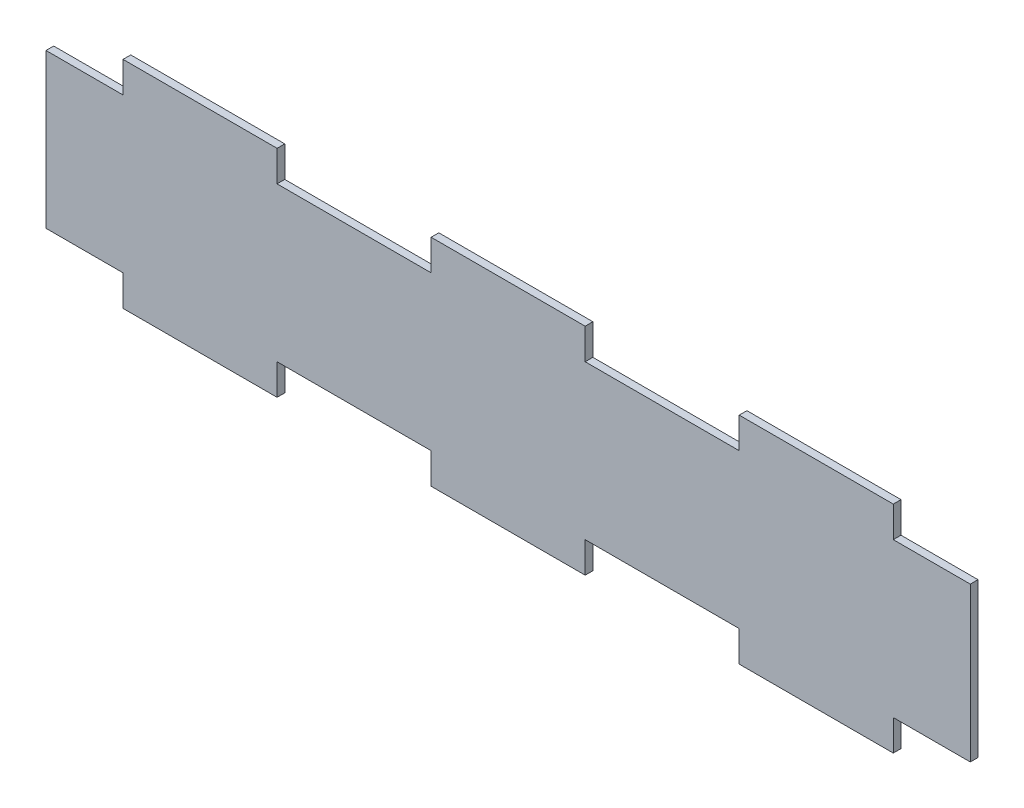
ISO-10303-21;
HEADER;
FILE_DESCRIPTION(('STEP AP214'),'2;1');
FILE_NAME('part.step','',(''),(''),'','','');
FILE_SCHEMA(('AUTOMOTIVE_DESIGN { 1 0 10303 214 1 1 1 1 }'));
ENDSEC;
DATA;
#1=APPLICATION_CONTEXT('core data for automotive mechanical design processes');
#2=APPLICATION_PROTOCOL_DEFINITION('international standard','automotive_design',2000,#1);
#3=PRODUCT_CONTEXT('',#1,'mechanical');
#4=PRODUCT('Part','Part','',(#3));
#5=PRODUCT_RELATED_PRODUCT_CATEGORY('part','',(#4));
#6=PRODUCT_DEFINITION_FORMATION('','',#4);
#7=PRODUCT_DEFINITION_CONTEXT('part definition',#1,'design');
#8=PRODUCT_DEFINITION('design','',#6,#7);
#9=PRODUCT_DEFINITION_SHAPE('','',#8);
#10=(LENGTH_UNIT() NAMED_UNIT(*) SI_UNIT(.MILLI.,.METRE.));
#11=(NAMED_UNIT(*) PLANE_ANGLE_UNIT() SI_UNIT($,.RADIAN.));
#12=(NAMED_UNIT(*) SI_UNIT($,.STERADIAN.) SOLID_ANGLE_UNIT());
#13=UNCERTAINTY_MEASURE_WITH_UNIT(LENGTH_MEASURE(1.E-05),#10,'distance_accuracy_value','');
#14=(GEOMETRIC_REPRESENTATION_CONTEXT(3) GLOBAL_UNCERTAINTY_ASSIGNED_CONTEXT((#13)) GLOBAL_UNIT_ASSIGNED_CONTEXT((#10,
#11,#12)) REPRESENTATION_CONTEXT('',''));
#15=CARTESIAN_POINT('',(0.,0.,0.));
#16=DIRECTION('',(0.,0.,1.));
#17=DIRECTION('',(1.,0.,0.));
#18=AXIS2_PLACEMENT_3D('',#15,#16,#17);
#19=CARTESIAN_POINT('',(900.,120.,5.));
#20=DIRECTION('',(-1.,0.,0.));
#21=DIRECTION('',(0.,0.,1.));
#22=AXIS2_PLACEMENT_3D('',#19,#20,#21);
#23=PLANE('',#22);
#24=DIRECTION('',(0.,1.,0.));
#25=VECTOR('',#24,1.);
#26=CARTESIAN_POINT('',(900.,120.,0.));
#27=LINE('',#26,#25);
#28=CARTESIAN_POINT('',(900.,100.,0.));
#29=VERTEX_POINT('',#28);
#30=CARTESIAN_POINT('',(900.,120.,0.));
#31=VERTEX_POINT('',#30);
#32=EDGE_CURVE('E266',#29,#31,#27,.T.);
#33=ORIENTED_EDGE('',*,*,#32,.T.);
#34=DIRECTION('',(0.,0.,-1.));
#35=VECTOR('',#34,1.);
#36=CARTESIAN_POINT('',(900.,120.,5.));
#37=LINE('',#36,#35);
#38=CARTESIAN_POINT('',(900.,120.,5.));
#39=VERTEX_POINT('',#38);
#40=EDGE_CURVE('E11',#39,#31,#37,.T.);
#41=ORIENTED_EDGE('',*,*,#40,.F.);
#42=DIRECTION('',(0.,1.,0.));
#43=VECTOR('',#42,1.);
#44=CARTESIAN_POINT('',(900.,120.,5.));
#45=LINE('',#44,#43);
#46=CARTESIAN_POINT('',(900.,100.,5.));
#47=VERTEX_POINT('',#46);
#48=EDGE_CURVE('E348',#47,#39,#45,.T.);
#49=ORIENTED_EDGE('',*,*,#48,.F.);
#50=DIRECTION('',(0.,0.,-1.));
#51=VECTOR('',#50,1.);
#52=CARTESIAN_POINT('',(900.,100.,5.));
#53=LINE('',#52,#51);
#54=EDGE_CURVE('E262',#47,#29,#53,.T.);
#55=ORIENTED_EDGE('',*,*,#54,.T.);
#56=EDGE_LOOP('',(#33,#41,#49,#55));
#57=FACE_BOUND('',#56,.T.);
#58=ADVANCED_FACE('F45',(#57),#23,.F.);
#59=CARTESIAN_POINT('',(800.,120.,5.));
#60=DIRECTION('',(0.,-1.,0.));
#61=DIRECTION('',(0.,0.,-1.));
#62=AXIS2_PLACEMENT_3D('',#59,#60,#61);
#63=PLANE('',#62);
#64=DIRECTION('',(-1.,0.,0.));
#65=VECTOR('',#64,1.);
#66=CARTESIAN_POINT('',(800.,120.,0.));
#67=LINE('',#66,#65);
#68=CARTESIAN_POINT('',(800.,120.,0.));
#69=VERTEX_POINT('',#68);
#70=EDGE_CURVE('E270',#31,#69,#67,.T.);
#71=ORIENTED_EDGE('',*,*,#70,.T.);
#72=DIRECTION('',(0.,0.,-1.));
#73=VECTOR('',#72,1.);
#74=CARTESIAN_POINT('',(800.,120.,5.));
#75=LINE('',#74,#73);
#76=CARTESIAN_POINT('',(800.,120.,5.));
#77=VERTEX_POINT('',#76);
#78=EDGE_CURVE('E54',#77,#69,#75,.T.);
#79=ORIENTED_EDGE('',*,*,#78,.F.);
#80=DIRECTION('',(-1.,0.,0.));
#81=VECTOR('',#80,1.);
#82=CARTESIAN_POINT('',(800.,120.,5.));
#83=LINE('',#82,#81);
#84=EDGE_CURVE('E165',#39,#77,#83,.T.);
#85=ORIENTED_EDGE('',*,*,#84,.F.);
#86=ORIENTED_EDGE('',*,*,#40,.T.);
#87=EDGE_LOOP('',(#71,#79,#85,#86));
#88=FACE_BOUND('',#87,.T.);
#89=ADVANCED_FACE('F554',(#88),#63,.F.);
#90=CARTESIAN_POINT('',(800.,100.,5.));
#91=DIRECTION('',(1.,0.,0.));
#92=DIRECTION('',(0.,0.,-1.));
#93=AXIS2_PLACEMENT_3D('',#90,#91,#92);
#94=PLANE('',#93);
#95=DIRECTION('',(0.,-1.,0.));
#96=VECTOR('',#95,1.);
#97=CARTESIAN_POINT('',(800.,100.,0.));
#98=LINE('',#97,#96);
#99=CARTESIAN_POINT('',(800.,100.,0.));
#100=VERTEX_POINT('',#99);
#101=EDGE_CURVE('E273',#69,#100,#98,.T.);
#102=ORIENTED_EDGE('',*,*,#101,.T.);
#103=DIRECTION('',(0.,0.,-1.));
#104=VECTOR('',#103,1.);
#105=CARTESIAN_POINT('',(800.,100.,5.));
#106=LINE('',#105,#104);
#107=CARTESIAN_POINT('',(800.,100.,5.));
#108=VERTEX_POINT('',#107);
#109=EDGE_CURVE('E439',#108,#100,#106,.T.);
#110=ORIENTED_EDGE('',*,*,#109,.F.);
#111=DIRECTION('',(0.,-1.,0.));
#112=VECTOR('',#111,1.);
#113=CARTESIAN_POINT('',(800.,100.,5.));
#114=LINE('',#113,#112);
#115=EDGE_CURVE('E449',#77,#108,#114,.T.);
#116=ORIENTED_EDGE('',*,*,#115,.F.);
#117=ORIENTED_EDGE('',*,*,#78,.T.);
#118=EDGE_LOOP('',(#102,#110,#116,#117));
#119=FACE_BOUND('',#118,.T.);
#120=ADVANCED_FACE('F447',(#119),#94,.F.);
#121=CARTESIAN_POINT('',(700.,100.,5.));
#122=DIRECTION('',(0.,-1.,0.));
#123=DIRECTION('',(0.,0.,-1.));
#124=AXIS2_PLACEMENT_3D('',#121,#122,#123);
#125=PLANE('',#124);
#126=DIRECTION('',(-1.,0.,0.));
#127=VECTOR('',#126,1.);
#128=CARTESIAN_POINT('',(700.,100.,0.));
#129=LINE('',#128,#127);
#130=CARTESIAN_POINT('',(700.,100.,0.));
#131=VERTEX_POINT('',#130);
#132=EDGE_CURVE('E276',#100,#131,#129,.T.);
#133=ORIENTED_EDGE('',*,*,#132,.T.);
#134=DIRECTION('',(0.,0.,-1.));
#135=VECTOR('',#134,1.);
#136=CARTESIAN_POINT('',(700.,100.,5.));
#137=LINE('',#136,#135);
#138=CARTESIAN_POINT('',(700.,100.,5.));
#139=VERTEX_POINT('',#138);
#140=EDGE_CURVE('E435',#139,#131,#137,.T.);
#141=ORIENTED_EDGE('',*,*,#140,.F.);
#142=DIRECTION('',(-1.,0.,0.));
#143=VECTOR('',#142,1.);
#144=CARTESIAN_POINT('',(700.,100.,5.));
#145=LINE('',#144,#143);
#146=EDGE_CURVE('E468',#108,#139,#145,.T.);
#147=ORIENTED_EDGE('',*,*,#146,.F.);
#148=ORIENTED_EDGE('',*,*,#109,.T.);
#149=EDGE_LOOP('',(#133,#141,#147,#148));
#150=FACE_BOUND('',#149,.T.);
#151=ADVANCED_FACE('F458',(#150),#125,.F.);
#152=CARTESIAN_POINT('',(700.,120.,5.));
#153=DIRECTION('',(-1.,0.,0.));
#154=DIRECTION('',(0.,0.,1.));
#155=AXIS2_PLACEMENT_3D('',#152,#153,#154);
#156=PLANE('',#155);
#157=DIRECTION('',(0.,1.,0.));
#158=VECTOR('',#157,1.);
#159=CARTESIAN_POINT('',(700.,120.,0.));
#160=LINE('',#159,#158);
#161=CARTESIAN_POINT('',(700.,120.,0.));
#162=VERTEX_POINT('',#161);
#163=EDGE_CURVE('E279',#131,#162,#160,.T.);
#164=ORIENTED_EDGE('',*,*,#163,.T.);
#165=DIRECTION('',(0.,0.,-1.));
#166=VECTOR('',#165,1.);
#167=CARTESIAN_POINT('',(700.,120.,5.));
#168=LINE('',#167,#166);
#169=CARTESIAN_POINT('',(700.,120.,5.));
#170=VERTEX_POINT('',#169);
#171=EDGE_CURVE('E431',#170,#162,#168,.T.);
#172=ORIENTED_EDGE('',*,*,#171,.F.);
#173=DIRECTION('',(0.,1.,0.));
#174=VECTOR('',#173,1.);
#175=CARTESIAN_POINT('',(700.,120.,5.));
#176=LINE('',#175,#174);
#177=EDGE_CURVE('E464',#139,#170,#176,.T.);
#178=ORIENTED_EDGE('',*,*,#177,.F.);
#179=ORIENTED_EDGE('',*,*,#140,.T.);
#180=EDGE_LOOP('',(#164,#172,#178,#179));
#181=FACE_BOUND('',#180,.T.);
#182=ADVANCED_FACE('F462',(#181),#156,.F.);
#183=CARTESIAN_POINT('',(600.,120.,5.));
#184=DIRECTION('',(0.,-1.,0.));
#185=DIRECTION('',(0.,0.,-1.));
#186=AXIS2_PLACEMENT_3D('',#183,#184,#185);
#187=PLANE('',#186);
#188=DIRECTION('',(-1.,0.,0.));
#189=VECTOR('',#188,1.);
#190=CARTESIAN_POINT('',(600.,120.,0.));
#191=LINE('',#190,#189);
#192=CARTESIAN_POINT('',(600.,120.,0.));
#193=VERTEX_POINT('',#192);
#194=EDGE_CURVE('E282',#162,#193,#191,.T.);
#195=ORIENTED_EDGE('',*,*,#194,.T.);
#196=DIRECTION('',(0.,0.,-1.));
#197=VECTOR('',#196,1.);
#198=CARTESIAN_POINT('',(600.,120.,5.));
#199=LINE('',#198,#197);
#200=CARTESIAN_POINT('',(600.,120.,5.));
#201=VERTEX_POINT('',#200);
#202=EDGE_CURVE('E427',#201,#193,#199,.T.);
#203=ORIENTED_EDGE('',*,*,#202,.F.);
#204=DIRECTION('',(-1.,0.,0.));
#205=VECTOR('',#204,1.);
#206=CARTESIAN_POINT('',(600.,120.,5.));
#207=LINE('',#206,#205);
#208=EDGE_CURVE('E467',#170,#201,#207,.T.);
#209=ORIENTED_EDGE('',*,*,#208,.F.);
#210=ORIENTED_EDGE('',*,*,#171,.T.);
#211=EDGE_LOOP('',(#195,#203,#209,#210));
#212=FACE_BOUND('',#211,.T.);
#213=ADVANCED_FACE('F567',(#212),#187,.F.);
#214=CARTESIAN_POINT('',(600.,100.,5.));
#215=DIRECTION('',(1.,0.,0.));
#216=DIRECTION('',(0.,0.,-1.));
#217=AXIS2_PLACEMENT_3D('',#214,#215,#216);
#218=PLANE('',#217);
#219=DIRECTION('',(0.,-1.,0.));
#220=VECTOR('',#219,1.);
#221=CARTESIAN_POINT('',(600.,100.,0.));
#222=LINE('',#221,#220);
#223=CARTESIAN_POINT('',(600.,100.,0.));
#224=VERTEX_POINT('',#223);
#225=EDGE_CURVE('E285',#193,#224,#222,.T.);
#226=ORIENTED_EDGE('',*,*,#225,.T.);
#227=DIRECTION('',(0.,0.,-1.));
#228=VECTOR('',#227,1.);
#229=CARTESIAN_POINT('',(600.,100.,5.));
#230=LINE('',#229,#228);
#231=CARTESIAN_POINT('',(600.,100.,5.));
#232=VERTEX_POINT('',#231);
#233=EDGE_CURVE('E423',#232,#224,#230,.T.);
#234=ORIENTED_EDGE('',*,*,#233,.F.);
#235=DIRECTION('',(0.,-1.,0.));
#236=VECTOR('',#235,1.);
#237=CARTESIAN_POINT('',(600.,100.,5.));
#238=LINE('',#237,#236);
#239=EDGE_CURVE('E472',#201,#232,#238,.T.);
#240=ORIENTED_EDGE('',*,*,#239,.F.);
#241=ORIENTED_EDGE('',*,*,#202,.T.);
#242=EDGE_LOOP('',(#226,#234,#240,#241));
#243=FACE_BOUND('',#242,.T.);
#244=ADVANCED_FACE('F570',(#243),#218,.F.);
#245=CARTESIAN_POINT('',(550.,100.,5.));
#246=DIRECTION('',(0.,-1.,0.));
#247=DIRECTION('',(0.,0.,-1.));
#248=AXIS2_PLACEMENT_3D('',#245,#246,#247);
#249=PLANE('',#248);
#250=DIRECTION('',(-1.,0.,0.));
#251=VECTOR('',#250,1.);
#252=CARTESIAN_POINT('',(550.,100.,0.));
#253=LINE('',#252,#251);
#254=CARTESIAN_POINT('',(550.,100.,0.));
#255=VERTEX_POINT('',#254);
#256=EDGE_CURVE('E288',#224,#255,#253,.T.);
#257=ORIENTED_EDGE('',*,*,#256,.T.);
#258=DIRECTION('',(0.,0.,-1.));
#259=VECTOR('',#258,1.);
#260=CARTESIAN_POINT('',(550.,100.,5.));
#261=LINE('',#260,#259);
#262=CARTESIAN_POINT('',(550.,100.,5.));
#263=VERTEX_POINT('',#262);
#264=EDGE_CURVE('E419',#263,#255,#261,.T.);
#265=ORIENTED_EDGE('',*,*,#264,.F.);
#266=DIRECTION('',(-1.,0.,0.));
#267=VECTOR('',#266,1.);
#268=CARTESIAN_POINT('',(550.,100.,5.));
#269=LINE('',#268,#267);
#270=EDGE_CURVE('E479',#232,#263,#269,.T.);
#271=ORIENTED_EDGE('',*,*,#270,.F.);
#272=ORIENTED_EDGE('',*,*,#233,.T.);
#273=EDGE_LOOP('',(#257,#265,#271,#272));
#274=FACE_BOUND('',#273,.T.);
#275=ADVANCED_FACE('F574',(#274),#249,.F.);
#276=CARTESIAN_POINT('',(550.,100.,5.));
#277=DIRECTION('',(1.,0.,0.));
#278=DIRECTION('',(0.,0.,-1.));
#279=AXIS2_PLACEMENT_3D('',#276,#277,#278);
#280=PLANE('',#279);
#281=DIRECTION('',(0.,-1.,0.));
#282=VECTOR('',#281,1.);
#283=CARTESIAN_POINT('',(550.,100.,0.));
#284=LINE('',#283,#282);
#285=CARTESIAN_POINT('',(550.,0.,0.));
#286=VERTEX_POINT('',#285);
#287=EDGE_CURVE('E291',#255,#286,#284,.T.);
#288=ORIENTED_EDGE('',*,*,#287,.T.);
#289=DIRECTION('',(0.,0.,-1.));
#290=VECTOR('',#289,1.);
#291=CARTESIAN_POINT('',(550.,0.,5.));
#292=LINE('',#291,#290);
#293=CARTESIAN_POINT('',(550.,0.,5.));
#294=VERTEX_POINT('',#293);
#295=EDGE_CURVE('E415',#294,#286,#292,.T.);
#296=ORIENTED_EDGE('',*,*,#295,.F.);
#297=DIRECTION('',(0.,-1.,0.));
#298=VECTOR('',#297,1.);
#299=CARTESIAN_POINT('',(550.,100.,5.));
#300=LINE('',#299,#298);
#301=EDGE_CURVE('E482',#263,#294,#300,.T.);
#302=ORIENTED_EDGE('',*,*,#301,.F.);
#303=ORIENTED_EDGE('',*,*,#264,.T.);
#304=EDGE_LOOP('',(#288,#296,#302,#303));
#305=FACE_BOUND('',#304,.T.);
#306=ADVANCED_FACE('F578',(#305),#280,.F.);
#307=CARTESIAN_POINT('',(600.,0.,5.));
#308=DIRECTION('',(0.,1.,0.));
#309=DIRECTION('',(0.,0.,1.));
#310=AXIS2_PLACEMENT_3D('',#307,#308,#309);
#311=PLANE('',#310);
#312=DIRECTION('',(1.,0.,0.));
#313=VECTOR('',#312,1.);
#314=CARTESIAN_POINT('',(600.,0.,0.));
#315=LINE('',#314,#313);
#316=CARTESIAN_POINT('',(600.,0.,0.));
#317=VERTEX_POINT('',#316);
#318=EDGE_CURVE('E294',#286,#317,#315,.T.);
#319=ORIENTED_EDGE('',*,*,#318,.T.);
#320=DIRECTION('',(0.,0.,-1.));
#321=VECTOR('',#320,1.);
#322=CARTESIAN_POINT('',(600.,0.,5.));
#323=LINE('',#322,#321);
#324=CARTESIAN_POINT('',(600.,0.,5.));
#325=VERTEX_POINT('',#324);
#326=EDGE_CURVE('E411',#325,#317,#323,.T.);
#327=ORIENTED_EDGE('',*,*,#326,.F.);
#328=DIRECTION('',(1.,0.,0.));
#329=VECTOR('',#328,1.);
#330=CARTESIAN_POINT('',(600.,0.,5.));
#331=LINE('',#330,#329);
#332=EDGE_CURVE('E485',#294,#325,#331,.T.);
#333=ORIENTED_EDGE('',*,*,#332,.F.);
#334=ORIENTED_EDGE('',*,*,#295,.T.);
#335=EDGE_LOOP('',(#319,#327,#333,#334));
#336=FACE_BOUND('',#335,.T.);
#337=ADVANCED_FACE('F582',(#336),#311,.F.);
#338=CARTESIAN_POINT('',(600.,-20.,5.));
#339=DIRECTION('',(1.,0.,0.));
#340=DIRECTION('',(0.,0.,-1.));
#341=AXIS2_PLACEMENT_3D('',#338,#339,#340);
#342=PLANE('',#341);
#343=DIRECTION('',(0.,-1.,0.));
#344=VECTOR('',#343,1.);
#345=CARTESIAN_POINT('',(600.,-20.,0.));
#346=LINE('',#345,#344);
#347=CARTESIAN_POINT('',(600.,-20.,0.));
#348=VERTEX_POINT('',#347);
#349=EDGE_CURVE('E297',#317,#348,#346,.T.);
#350=ORIENTED_EDGE('',*,*,#349,.T.);
#351=DIRECTION('',(0.,0.,-1.));
#352=VECTOR('',#351,1.);
#353=CARTESIAN_POINT('',(600.,-20.,5.));
#354=LINE('',#353,#352);
#355=CARTESIAN_POINT('',(600.,-20.,5.));
#356=VERTEX_POINT('',#355);
#357=EDGE_CURVE('E407',#356,#348,#354,.T.);
#358=ORIENTED_EDGE('',*,*,#357,.F.);
#359=DIRECTION('',(0.,-1.,0.));
#360=VECTOR('',#359,1.);
#361=CARTESIAN_POINT('',(600.,-20.,5.));
#362=LINE('',#361,#360);
#363=EDGE_CURVE('E488',#325,#356,#362,.T.);
#364=ORIENTED_EDGE('',*,*,#363,.F.);
#365=ORIENTED_EDGE('',*,*,#326,.T.);
#366=EDGE_LOOP('',(#350,#358,#364,#365));
#367=FACE_BOUND('',#366,.T.);
#368=ADVANCED_FACE('F586',(#367),#342,.F.);
#369=CARTESIAN_POINT('',(700.,-20.,5.));
#370=DIRECTION('',(0.,1.,0.));
#371=DIRECTION('',(0.,0.,1.));
#372=AXIS2_PLACEMENT_3D('',#369,#370,#371);
#373=PLANE('',#372);
#374=DIRECTION('',(1.,0.,0.));
#375=VECTOR('',#374,1.);
#376=CARTESIAN_POINT('',(700.,-20.,0.));
#377=LINE('',#376,#375);
#378=CARTESIAN_POINT('',(700.,-20.,0.));
#379=VERTEX_POINT('',#378);
#380=EDGE_CURVE('E300',#348,#379,#377,.T.);
#381=ORIENTED_EDGE('',*,*,#380,.T.);
#382=DIRECTION('',(0.,0.,-1.));
#383=VECTOR('',#382,1.);
#384=CARTESIAN_POINT('',(700.,-20.,5.));
#385=LINE('',#384,#383);
#386=CARTESIAN_POINT('',(700.,-20.,5.));
#387=VERTEX_POINT('',#386);
#388=EDGE_CURVE('E403',#387,#379,#385,.T.);
#389=ORIENTED_EDGE('',*,*,#388,.F.);
#390=DIRECTION('',(1.,0.,0.));
#391=VECTOR('',#390,1.);
#392=CARTESIAN_POINT('',(700.,-20.,5.));
#393=LINE('',#392,#391);
#394=EDGE_CURVE('E491',#356,#387,#393,.T.);
#395=ORIENTED_EDGE('',*,*,#394,.F.);
#396=ORIENTED_EDGE('',*,*,#357,.T.);
#397=EDGE_LOOP('',(#381,#389,#395,#396));
#398=FACE_BOUND('',#397,.T.);
#399=ADVANCED_FACE('F590',(#398),#373,.F.);
#400=CARTESIAN_POINT('',(700.,0.,5.));
#401=DIRECTION('',(-1.,0.,0.));
#402=DIRECTION('',(0.,0.,1.));
#403=AXIS2_PLACEMENT_3D('',#400,#401,#402);
#404=PLANE('',#403);
#405=DIRECTION('',(0.,1.,0.));
#406=VECTOR('',#405,1.);
#407=CARTESIAN_POINT('',(700.,0.,0.));
#408=LINE('',#407,#406);
#409=CARTESIAN_POINT('',(700.,0.,0.));
#410=VERTEX_POINT('',#409);
#411=EDGE_CURVE('E303',#379,#410,#408,.T.);
#412=ORIENTED_EDGE('',*,*,#411,.T.);
#413=DIRECTION('',(0.,0.,-1.));
#414=VECTOR('',#413,1.);
#415=CARTESIAN_POINT('',(700.,0.,5.));
#416=LINE('',#415,#414);
#417=CARTESIAN_POINT('',(700.,0.,5.));
#418=VERTEX_POINT('',#417);
#419=EDGE_CURVE('E399',#418,#410,#416,.T.);
#420=ORIENTED_EDGE('',*,*,#419,.F.);
#421=DIRECTION('',(0.,1.,0.));
#422=VECTOR('',#421,1.);
#423=CARTESIAN_POINT('',(700.,0.,5.));
#424=LINE('',#423,#422);
#425=EDGE_CURVE('E494',#387,#418,#424,.T.);
#426=ORIENTED_EDGE('',*,*,#425,.F.);
#427=ORIENTED_EDGE('',*,*,#388,.T.);
#428=EDGE_LOOP('',(#412,#420,#426,#427));
#429=FACE_BOUND('',#428,.T.);
#430=ADVANCED_FACE('F594',(#429),#404,.F.);
#431=CARTESIAN_POINT('',(800.,0.,5.));
#432=DIRECTION('',(0.,1.,0.));
#433=DIRECTION('',(0.,0.,1.));
#434=AXIS2_PLACEMENT_3D('',#431,#432,#433);
#435=PLANE('',#434);
#436=DIRECTION('',(1.,0.,0.));
#437=VECTOR('',#436,1.);
#438=CARTESIAN_POINT('',(800.,0.,0.));
#439=LINE('',#438,#437);
#440=CARTESIAN_POINT('',(800.,0.,0.));
#441=VERTEX_POINT('',#440);
#442=EDGE_CURVE('E306',#410,#441,#439,.T.);
#443=ORIENTED_EDGE('',*,*,#442,.T.);
#444=DIRECTION('',(0.,0.,-1.));
#445=VECTOR('',#444,1.);
#446=CARTESIAN_POINT('',(800.,0.,5.));
#447=LINE('',#446,#445);
#448=CARTESIAN_POINT('',(800.,0.,5.));
#449=VERTEX_POINT('',#448);
#450=EDGE_CURVE('E395',#449,#441,#447,.T.);
#451=ORIENTED_EDGE('',*,*,#450,.F.);
#452=DIRECTION('',(1.,0.,0.));
#453=VECTOR('',#452,1.);
#454=CARTESIAN_POINT('',(800.,0.,5.));
#455=LINE('',#454,#453);
#456=EDGE_CURVE('E497',#418,#449,#455,.T.);
#457=ORIENTED_EDGE('',*,*,#456,.F.);
#458=ORIENTED_EDGE('',*,*,#419,.T.);
#459=EDGE_LOOP('',(#443,#451,#457,#458));
#460=FACE_BOUND('',#459,.T.);
#461=ADVANCED_FACE('F598',(#460),#435,.F.);
#462=CARTESIAN_POINT('',(800.,-20.,5.));
#463=DIRECTION('',(1.,0.,0.));
#464=DIRECTION('',(0.,0.,-1.));
#465=AXIS2_PLACEMENT_3D('',#462,#463,#464);
#466=PLANE('',#465);
#467=DIRECTION('',(0.,-1.,0.));
#468=VECTOR('',#467,1.);
#469=CARTESIAN_POINT('',(800.,-20.,0.));
#470=LINE('',#469,#468);
#471=CARTESIAN_POINT('',(800.,-20.,0.));
#472=VERTEX_POINT('',#471);
#473=EDGE_CURVE('E309',#441,#472,#470,.T.);
#474=ORIENTED_EDGE('',*,*,#473,.T.);
#475=DIRECTION('',(0.,0.,-1.));
#476=VECTOR('',#475,1.);
#477=CARTESIAN_POINT('',(800.,-20.,5.));
#478=LINE('',#477,#476);
#479=CARTESIAN_POINT('',(800.,-20.,5.));
#480=VERTEX_POINT('',#479);
#481=EDGE_CURVE('E391',#480,#472,#478,.T.);
#482=ORIENTED_EDGE('',*,*,#481,.F.);
#483=DIRECTION('',(0.,-1.,0.));
#484=VECTOR('',#483,1.);
#485=CARTESIAN_POINT('',(800.,-20.,5.));
#486=LINE('',#485,#484);
#487=EDGE_CURVE('E500',#449,#480,#486,.T.);
#488=ORIENTED_EDGE('',*,*,#487,.F.);
#489=ORIENTED_EDGE('',*,*,#450,.T.);
#490=EDGE_LOOP('',(#474,#482,#488,#489));
#491=FACE_BOUND('',#490,.T.);
#492=ADVANCED_FACE('F602',(#491),#466,.F.);
#493=CARTESIAN_POINT('',(900.,-20.,5.));
#494=DIRECTION('',(0.,1.,0.));
#495=DIRECTION('',(0.,0.,1.));
#496=AXIS2_PLACEMENT_3D('',#493,#494,#495);
#497=PLANE('',#496);
#498=DIRECTION('',(1.,0.,0.));
#499=VECTOR('',#498,1.);
#500=CARTESIAN_POINT('',(900.,-20.,0.));
#501=LINE('',#500,#499);
#502=CARTESIAN_POINT('',(900.,-20.,0.));
#503=VERTEX_POINT('',#502);
#504=EDGE_CURVE('E312',#472,#503,#501,.T.);
#505=ORIENTED_EDGE('',*,*,#504,.T.);
#506=DIRECTION('',(0.,0.,-1.));
#507=VECTOR('',#506,1.);
#508=CARTESIAN_POINT('',(900.,-20.,5.));
#509=LINE('',#508,#507);
#510=CARTESIAN_POINT('',(900.,-20.,5.));
#511=VERTEX_POINT('',#510);
#512=EDGE_CURVE('E387',#511,#503,#509,.T.);
#513=ORIENTED_EDGE('',*,*,#512,.F.);
#514=DIRECTION('',(1.,0.,0.));
#515=VECTOR('',#514,1.);
#516=CARTESIAN_POINT('',(900.,-20.,5.));
#517=LINE('',#516,#515);
#518=EDGE_CURVE('E503',#480,#511,#517,.T.);
#519=ORIENTED_EDGE('',*,*,#518,.F.);
#520=ORIENTED_EDGE('',*,*,#481,.T.);
#521=EDGE_LOOP('',(#505,#513,#519,#520));
#522=FACE_BOUND('',#521,.T.);
#523=ADVANCED_FACE('F606',(#522),#497,.F.);
#524=CARTESIAN_POINT('',(900.,0.,5.));
#525=DIRECTION('',(-1.,0.,0.));
#526=DIRECTION('',(0.,0.,1.));
#527=AXIS2_PLACEMENT_3D('',#524,#525,#526);
#528=PLANE('',#527);
#529=DIRECTION('',(0.,1.,0.));
#530=VECTOR('',#529,1.);
#531=CARTESIAN_POINT('',(900.,0.,0.));
#532=LINE('',#531,#530);
#533=CARTESIAN_POINT('',(900.,0.,0.));
#534=VERTEX_POINT('',#533);
#535=EDGE_CURVE('E315',#503,#534,#532,.T.);
#536=ORIENTED_EDGE('',*,*,#535,.T.);
#537=DIRECTION('',(0.,0.,-1.));
#538=VECTOR('',#537,1.);
#539=CARTESIAN_POINT('',(900.,0.,5.));
#540=LINE('',#539,#538);
#541=CARTESIAN_POINT('',(900.,0.,5.));
#542=VERTEX_POINT('',#541);
#543=EDGE_CURVE('E383',#542,#534,#540,.T.);
#544=ORIENTED_EDGE('',*,*,#543,.F.);
#545=DIRECTION('',(0.,1.,0.));
#546=VECTOR('',#545,1.);
#547=CARTESIAN_POINT('',(900.,0.,5.));
#548=LINE('',#547,#546);
#549=EDGE_CURVE('E506',#511,#542,#548,.T.);
#550=ORIENTED_EDGE('',*,*,#549,.F.);
#551=ORIENTED_EDGE('',*,*,#512,.T.);
#552=EDGE_LOOP('',(#536,#544,#550,#551));
#553=FACE_BOUND('',#552,.T.);
#554=ADVANCED_FACE('F610',(#553),#528,.F.);
#555=CARTESIAN_POINT('',(1000.,0.,5.));
#556=DIRECTION('',(0.,1.,0.));
#557=DIRECTION('',(0.,0.,1.));
#558=AXIS2_PLACEMENT_3D('',#555,#556,#557);
#559=PLANE('',#558);
#560=DIRECTION('',(1.,0.,0.));
#561=VECTOR('',#560,1.);
#562=CARTESIAN_POINT('',(1000.,0.,0.));
#563=LINE('',#562,#561);
#564=CARTESIAN_POINT('',(1000.,0.,0.));
#565=VERTEX_POINT('',#564);
#566=EDGE_CURVE('E318',#534,#565,#563,.T.);
#567=ORIENTED_EDGE('',*,*,#566,.T.);
#568=DIRECTION('',(0.,0.,-1.));
#569=VECTOR('',#568,1.);
#570=CARTESIAN_POINT('',(1000.,0.,5.));
#571=LINE('',#570,#569);
#572=CARTESIAN_POINT('',(1000.,0.,5.));
#573=VERTEX_POINT('',#572);
#574=EDGE_CURVE('E379',#573,#565,#571,.T.);
#575=ORIENTED_EDGE('',*,*,#574,.F.);
#576=DIRECTION('',(1.,0.,0.));
#577=VECTOR('',#576,1.);
#578=CARTESIAN_POINT('',(1000.,0.,5.));
#579=LINE('',#578,#577);
#580=EDGE_CURVE('E509',#542,#573,#579,.T.);
#581=ORIENTED_EDGE('',*,*,#580,.F.);
#582=ORIENTED_EDGE('',*,*,#543,.T.);
#583=EDGE_LOOP('',(#567,#575,#581,#582));
#584=FACE_BOUND('',#583,.T.);
#585=ADVANCED_FACE('F614',(#584),#559,.F.);
#586=CARTESIAN_POINT('',(1000.,-20.,5.));
#587=DIRECTION('',(1.,0.,0.));
#588=DIRECTION('',(0.,0.,-1.));
#589=AXIS2_PLACEMENT_3D('',#586,#587,#588);
#590=PLANE('',#589);
#591=DIRECTION('',(0.,-1.,0.));
#592=VECTOR('',#591,1.);
#593=CARTESIAN_POINT('',(1000.,-20.,0.));
#594=LINE('',#593,#592);
#595=CARTESIAN_POINT('',(1000.,-20.,0.));
#596=VERTEX_POINT('',#595);
#597=EDGE_CURVE('E321',#565,#596,#594,.T.);
#598=ORIENTED_EDGE('',*,*,#597,.T.);
#599=DIRECTION('',(0.,0.,-1.));
#600=VECTOR('',#599,1.);
#601=CARTESIAN_POINT('',(1000.,-20.,5.));
#602=LINE('',#601,#600);
#603=CARTESIAN_POINT('',(1000.,-20.,5.));
#604=VERTEX_POINT('',#603);
#605=EDGE_CURVE('E375',#604,#596,#602,.T.);
#606=ORIENTED_EDGE('',*,*,#605,.F.);
#607=DIRECTION('',(0.,-1.,0.));
#608=VECTOR('',#607,1.);
#609=CARTESIAN_POINT('',(1000.,-20.,5.));
#610=LINE('',#609,#608);
#611=EDGE_CURVE('E512',#573,#604,#610,.T.);
#612=ORIENTED_EDGE('',*,*,#611,.F.);
#613=ORIENTED_EDGE('',*,*,#574,.T.);
#614=EDGE_LOOP('',(#598,#606,#612,#613));
#615=FACE_BOUND('',#614,.T.);
#616=ADVANCED_FACE('F618',(#615),#590,.F.);
#617=CARTESIAN_POINT('',(1100.,-20.,5.));
#618=DIRECTION('',(0.,1.,0.));
#619=DIRECTION('',(0.,0.,1.));
#620=AXIS2_PLACEMENT_3D('',#617,#618,#619);
#621=PLANE('',#620);
#622=DIRECTION('',(1.,0.,0.));
#623=VECTOR('',#622,1.);
#624=CARTESIAN_POINT('',(1100.,-20.,0.));
#625=LINE('',#624,#623);
#626=CARTESIAN_POINT('',(1100.,-20.,0.));
#627=VERTEX_POINT('',#626);
#628=EDGE_CURVE('E324',#596,#627,#625,.T.);
#629=ORIENTED_EDGE('',*,*,#628,.T.);
#630=DIRECTION('',(0.,0.,-1.));
#631=VECTOR('',#630,1.);
#632=CARTESIAN_POINT('',(1100.,-20.,5.));
#633=LINE('',#632,#631);
#634=CARTESIAN_POINT('',(1100.,-20.,5.));
#635=VERTEX_POINT('',#634);
#636=EDGE_CURVE('E371',#635,#627,#633,.T.);
#637=ORIENTED_EDGE('',*,*,#636,.F.);
#638=DIRECTION('',(1.,0.,0.));
#639=VECTOR('',#638,1.);
#640=CARTESIAN_POINT('',(1100.,-20.,5.));
#641=LINE('',#640,#639);
#642=EDGE_CURVE('E515',#604,#635,#641,.T.);
#643=ORIENTED_EDGE('',*,*,#642,.F.);
#644=ORIENTED_EDGE('',*,*,#605,.T.);
#645=EDGE_LOOP('',(#629,#637,#643,#644));
#646=FACE_BOUND('',#645,.T.);
#647=ADVANCED_FACE('F622',(#646),#621,.F.);
#648=CARTESIAN_POINT('',(1100.,0.,5.));
#649=DIRECTION('',(-1.,0.,0.));
#650=DIRECTION('',(0.,0.,1.));
#651=AXIS2_PLACEMENT_3D('',#648,#649,#650);
#652=PLANE('',#651);
#653=DIRECTION('',(0.,1.,0.));
#654=VECTOR('',#653,1.);
#655=CARTESIAN_POINT('',(1100.,0.,0.));
#656=LINE('',#655,#654);
#657=CARTESIAN_POINT('',(1100.,0.,0.));
#658=VERTEX_POINT('',#657);
#659=EDGE_CURVE('E327',#627,#658,#656,.T.);
#660=ORIENTED_EDGE('',*,*,#659,.T.);
#661=DIRECTION('',(0.,0.,-1.));
#662=VECTOR('',#661,1.);
#663=CARTESIAN_POINT('',(1100.,0.,5.));
#664=LINE('',#663,#662);
#665=CARTESIAN_POINT('',(1100.,0.,5.));
#666=VERTEX_POINT('',#665);
#667=EDGE_CURVE('E367',#666,#658,#664,.T.);
#668=ORIENTED_EDGE('',*,*,#667,.F.);
#669=DIRECTION('',(0.,1.,0.));
#670=VECTOR('',#669,1.);
#671=CARTESIAN_POINT('',(1100.,0.,5.));
#672=LINE('',#671,#670);
#673=EDGE_CURVE('E518',#635,#666,#672,.T.);
#674=ORIENTED_EDGE('',*,*,#673,.F.);
#675=ORIENTED_EDGE('',*,*,#636,.T.);
#676=EDGE_LOOP('',(#660,#668,#674,#675));
#677=FACE_BOUND('',#676,.T.);
#678=ADVANCED_FACE('F626',(#677),#652,.F.);
#679=CARTESIAN_POINT('',(1150.,0.,5.));
#680=DIRECTION('',(0.,1.,0.));
#681=DIRECTION('',(0.,0.,1.));
#682=AXIS2_PLACEMENT_3D('',#679,#680,#681);
#683=PLANE('',#682);
#684=DIRECTION('',(1.,0.,0.));
#685=VECTOR('',#684,1.);
#686=CARTESIAN_POINT('',(1150.,0.,0.));
#687=LINE('',#686,#685);
#688=CARTESIAN_POINT('',(1150.,0.,0.));
#689=VERTEX_POINT('',#688);
#690=EDGE_CURVE('E330',#658,#689,#687,.T.);
#691=ORIENTED_EDGE('',*,*,#690,.T.);
#692=DIRECTION('',(0.,0.,-1.));
#693=VECTOR('',#692,1.);
#694=CARTESIAN_POINT('',(1150.,0.,5.));
#695=LINE('',#694,#693);
#696=CARTESIAN_POINT('',(1150.,0.,5.));
#697=VERTEX_POINT('',#696);
#698=EDGE_CURVE('E363',#697,#689,#695,.T.);
#699=ORIENTED_EDGE('',*,*,#698,.F.);
#700=DIRECTION('',(1.,0.,0.));
#701=VECTOR('',#700,1.);
#702=CARTESIAN_POINT('',(1150.,0.,5.));
#703=LINE('',#702,#701);
#704=EDGE_CURVE('E521',#666,#697,#703,.T.);
#705=ORIENTED_EDGE('',*,*,#704,.F.);
#706=ORIENTED_EDGE('',*,*,#667,.T.);
#707=EDGE_LOOP('',(#691,#699,#705,#706));
#708=FACE_BOUND('',#707,.T.);
#709=ADVANCED_FACE('F630',(#708),#683,.F.);
#710=CARTESIAN_POINT('',(1150.,100.,5.));
#711=DIRECTION('',(-1.,0.,0.));
#712=DIRECTION('',(0.,0.,1.));
#713=AXIS2_PLACEMENT_3D('',#710,#711,#712);
#714=PLANE('',#713);
#715=DIRECTION('',(0.,1.,0.));
#716=VECTOR('',#715,1.);
#717=CARTESIAN_POINT('',(1150.,100.,0.));
#718=LINE('',#717,#716);
#719=CARTESIAN_POINT('',(1150.,100.,0.));
#720=VERTEX_POINT('',#719);
#721=EDGE_CURVE('E333',#689,#720,#718,.T.);
#722=ORIENTED_EDGE('',*,*,#721,.T.);
#723=DIRECTION('',(0.,0.,-1.));
#724=VECTOR('',#723,1.);
#725=CARTESIAN_POINT('',(1150.,100.,5.));
#726=LINE('',#725,#724);
#727=CARTESIAN_POINT('',(1150.,100.,5.));
#728=VERTEX_POINT('',#727);
#729=EDGE_CURVE('E359',#728,#720,#726,.T.);
#730=ORIENTED_EDGE('',*,*,#729,.F.);
#731=DIRECTION('',(0.,1.,0.));
#732=VECTOR('',#731,1.);
#733=CARTESIAN_POINT('',(1150.,100.,5.));
#734=LINE('',#733,#732);
#735=EDGE_CURVE('E524',#697,#728,#734,.T.);
#736=ORIENTED_EDGE('',*,*,#735,.F.);
#737=ORIENTED_EDGE('',*,*,#698,.T.);
#738=EDGE_LOOP('',(#722,#730,#736,#737));
#739=FACE_BOUND('',#738,.T.);
#740=ADVANCED_FACE('F634',(#739),#714,.F.);
#741=CARTESIAN_POINT('',(1100.,100.,5.));
#742=DIRECTION('',(0.,-1.,0.));
#743=DIRECTION('',(0.,0.,-1.));
#744=AXIS2_PLACEMENT_3D('',#741,#742,#743);
#745=PLANE('',#744);
#746=DIRECTION('',(-1.,0.,0.));
#747=VECTOR('',#746,1.);
#748=CARTESIAN_POINT('',(1100.,100.,0.));
#749=LINE('',#748,#747);
#750=CARTESIAN_POINT('',(1100.,100.,0.));
#751=VERTEX_POINT('',#750);
#752=EDGE_CURVE('E336',#720,#751,#749,.T.);
#753=ORIENTED_EDGE('',*,*,#752,.T.);
#754=DIRECTION('',(0.,0.,-1.));
#755=VECTOR('',#754,1.);
#756=CARTESIAN_POINT('',(1100.,100.,5.));
#757=LINE('',#756,#755);
#758=CARTESIAN_POINT('',(1100.,100.,5.));
#759=VERTEX_POINT('',#758);
#760=EDGE_CURVE('E355',#759,#751,#757,.T.);
#761=ORIENTED_EDGE('',*,*,#760,.F.);
#762=DIRECTION('',(-1.,0.,0.));
#763=VECTOR('',#762,1.);
#764=CARTESIAN_POINT('',(1100.,100.,5.));
#765=LINE('',#764,#763);
#766=EDGE_CURVE('E527',#728,#759,#765,.T.);
#767=ORIENTED_EDGE('',*,*,#766,.F.);
#768=ORIENTED_EDGE('',*,*,#729,.T.);
#769=EDGE_LOOP('',(#753,#761,#767,#768));
#770=FACE_BOUND('',#769,.T.);
#771=ADVANCED_FACE('F535',(#770),#745,.F.);
#772=CARTESIAN_POINT('',(1100.,120.,5.));
#773=DIRECTION('',(-1.,0.,0.));
#774=DIRECTION('',(0.,0.,1.));
#775=AXIS2_PLACEMENT_3D('',#772,#773,#774);
#776=PLANE('',#775);
#777=DIRECTION('',(0.,1.,0.));
#778=VECTOR('',#777,1.);
#779=CARTESIAN_POINT('',(1100.,120.,0.));
#780=LINE('',#779,#778);
#781=CARTESIAN_POINT('',(1100.,120.,0.));
#782=VERTEX_POINT('',#781);
#783=EDGE_CURVE('E339',#751,#782,#780,.T.);
#784=ORIENTED_EDGE('',*,*,#783,.T.);
#785=DIRECTION('',(0.,0.,-1.));
#786=VECTOR('',#785,1.);
#787=CARTESIAN_POINT('',(1100.,120.,5.));
#788=LINE('',#787,#786);
#789=CARTESIAN_POINT('',(1100.,120.,5.));
#790=VERTEX_POINT('',#789);
#791=EDGE_CURVE('E255',#790,#782,#788,.T.);
#792=ORIENTED_EDGE('',*,*,#791,.F.);
#793=DIRECTION('',(0.,1.,0.));
#794=VECTOR('',#793,1.);
#795=CARTESIAN_POINT('',(1100.,120.,5.));
#796=LINE('',#795,#794);
#797=EDGE_CURVE('E244',#759,#790,#796,.T.);
#798=ORIENTED_EDGE('',*,*,#797,.F.);
#799=ORIENTED_EDGE('',*,*,#760,.T.);
#800=EDGE_LOOP('',(#784,#792,#798,#799));
#801=FACE_BOUND('',#800,.T.);
#802=ADVANCED_FACE('F539',(#801),#776,.F.);
#803=CARTESIAN_POINT('',(1000.,120.,5.));
#804=DIRECTION('',(0.,-1.,0.));
#805=DIRECTION('',(0.,0.,-1.));
#806=AXIS2_PLACEMENT_3D('',#803,#804,#805);
#807=PLANE('',#806);
#808=DIRECTION('',(-1.,0.,0.));
#809=VECTOR('',#808,1.);
#810=CARTESIAN_POINT('',(1000.,120.,0.));
#811=LINE('',#810,#809);
#812=CARTESIAN_POINT('',(1000.,120.,0.));
#813=VERTEX_POINT('',#812);
#814=EDGE_CURVE('E253',#782,#813,#811,.T.);
#815=ORIENTED_EDGE('',*,*,#814,.T.);
#816=DIRECTION('',(0.,0.,-1.));
#817=VECTOR('',#816,1.);
#818=CARTESIAN_POINT('',(1000.,120.,5.));
#819=LINE('',#818,#817);
#820=CARTESIAN_POINT('',(1000.,120.,5.));
#821=VERTEX_POINT('',#820);
#822=EDGE_CURVE('E250',#821,#813,#819,.T.);
#823=ORIENTED_EDGE('',*,*,#822,.F.);
#824=DIRECTION('',(-1.,0.,0.));
#825=VECTOR('',#824,1.);
#826=CARTESIAN_POINT('',(1000.,120.,5.));
#827=LINE('',#826,#825);
#828=EDGE_CURVE('E238',#790,#821,#827,.T.);
#829=ORIENTED_EDGE('',*,*,#828,.F.);
#830=ORIENTED_EDGE('',*,*,#791,.T.);
#831=EDGE_LOOP('',(#815,#823,#829,#830));
#832=FACE_BOUND('',#831,.T.);
#833=ADVANCED_FACE('F251',(#832),#807,.F.);
#834=CARTESIAN_POINT('',(1000.,100.,5.));
#835=DIRECTION('',(1.,0.,0.));
#836=DIRECTION('',(0.,0.,-1.));
#837=AXIS2_PLACEMENT_3D('',#834,#835,#836);
#838=PLANE('',#837);
#839=DIRECTION('',(0.,-1.,0.));
#840=VECTOR('',#839,1.);
#841=CARTESIAN_POINT('',(1000.,100.,0.));
#842=LINE('',#841,#840);
#843=CARTESIAN_POINT('',(1000.,100.,0.));
#844=VERTEX_POINT('',#843);
#845=EDGE_CURVE('E151',#813,#844,#842,.T.);
#846=ORIENTED_EDGE('',*,*,#845,.T.);
#847=DIRECTION('',(0.,0.,-1.));
#848=VECTOR('',#847,1.);
#849=CARTESIAN_POINT('',(1000.,100.,5.));
#850=LINE('',#849,#848);
#851=CARTESIAN_POINT('',(1000.,100.,5.));
#852=VERTEX_POINT('',#851);
#853=EDGE_CURVE('E256',#852,#844,#850,.T.);
#854=ORIENTED_EDGE('',*,*,#853,.F.);
#855=DIRECTION('',(0.,-1.,0.));
#856=VECTOR('',#855,1.);
#857=CARTESIAN_POINT('',(1000.,100.,5.));
#858=LINE('',#857,#856);
#859=EDGE_CURVE('E242',#821,#852,#858,.T.);
#860=ORIENTED_EDGE('',*,*,#859,.F.);
#861=ORIENTED_EDGE('',*,*,#822,.T.);
#862=EDGE_LOOP('',(#846,#854,#860,#861));
#863=FACE_BOUND('',#862,.T.);
#864=ADVANCED_FACE('F258',(#863),#838,.F.);
#865=CARTESIAN_POINT('',(900.,100.,5.));
#866=DIRECTION('',(0.,-1.,0.));
#867=DIRECTION('',(0.,0.,-1.));
#868=AXIS2_PLACEMENT_3D('',#865,#866,#867);
#869=PLANE('',#868);
#870=DIRECTION('',(-1.,0.,0.));
#871=VECTOR('',#870,1.);
#872=CARTESIAN_POINT('',(900.,100.,0.));
#873=LINE('',#872,#871);
#874=EDGE_CURVE('E157',#844,#29,#873,.T.);
#875=ORIENTED_EDGE('',*,*,#874,.T.);
#876=ORIENTED_EDGE('',*,*,#54,.F.);
#877=DIRECTION('',(-1.,0.,0.));
#878=VECTOR('',#877,1.);
#879=CARTESIAN_POINT('',(900.,100.,5.));
#880=LINE('',#879,#878);
#881=EDGE_CURVE('E62',#852,#47,#880,.T.);
#882=ORIENTED_EDGE('',*,*,#881,.F.);
#883=ORIENTED_EDGE('',*,*,#853,.T.);
#884=EDGE_LOOP('',(#875,#876,#882,#883));
#885=FACE_BOUND('',#884,.T.);
#886=ADVANCED_FACE('F543',(#885),#869,.F.);
#887=CARTESIAN_POINT('',(0.,0.,5.));
#888=DIRECTION('',(0.,0.,1.));
#889=DIRECTION('',(1.,0.,0.));
#890=AXIS2_PLACEMENT_3D('',#887,#888,#889);
#891=PLANE('',#890);
#892=ORIENTED_EDGE('',*,*,#48,.T.);
#893=ORIENTED_EDGE('',*,*,#84,.T.);
#894=ORIENTED_EDGE('',*,*,#115,.T.);
#895=ORIENTED_EDGE('',*,*,#146,.T.);
#896=ORIENTED_EDGE('',*,*,#177,.T.);
#897=ORIENTED_EDGE('',*,*,#208,.T.);
#898=ORIENTED_EDGE('',*,*,#239,.T.);
#899=ORIENTED_EDGE('',*,*,#270,.T.);
#900=ORIENTED_EDGE('',*,*,#301,.T.);
#901=ORIENTED_EDGE('',*,*,#332,.T.);
#902=ORIENTED_EDGE('',*,*,#363,.T.);
#903=ORIENTED_EDGE('',*,*,#394,.T.);
#904=ORIENTED_EDGE('',*,*,#425,.T.);
#905=ORIENTED_EDGE('',*,*,#456,.T.);
#906=ORIENTED_EDGE('',*,*,#487,.T.);
#907=ORIENTED_EDGE('',*,*,#518,.T.);
#908=ORIENTED_EDGE('',*,*,#549,.T.);
#909=ORIENTED_EDGE('',*,*,#580,.T.);
#910=ORIENTED_EDGE('',*,*,#611,.T.);
#911=ORIENTED_EDGE('',*,*,#642,.T.);
#912=ORIENTED_EDGE('',*,*,#673,.T.);
#913=ORIENTED_EDGE('',*,*,#704,.T.);
#914=ORIENTED_EDGE('',*,*,#735,.T.);
#915=ORIENTED_EDGE('',*,*,#766,.T.);
#916=ORIENTED_EDGE('',*,*,#797,.T.);
#917=ORIENTED_EDGE('',*,*,#828,.T.);
#918=ORIENTED_EDGE('',*,*,#859,.T.);
#919=ORIENTED_EDGE('',*,*,#881,.T.);
#920=EDGE_LOOP('',(#892,#893,#894,#895,#896,#897,#898,#899,#900,#901,#902,#903,#904,#905,#906,
#907,#908,#909,#910,#911,#912,#913,#914,#915,#916,#917,#918,#919));
#921=FACE_BOUND('',#920,.T.);
#922=ADVANCED_FACE('F240',(#921),#891,.T.);
#923=CARTESIAN_POINT('',(0.,0.,0.));
#924=DIRECTION('',(0.,0.,1.));
#925=DIRECTION('',(1.,0.,0.));
#926=AXIS2_PLACEMENT_3D('',#923,#924,#925);
#927=PLANE('',#926);
#928=ORIENTED_EDGE('',*,*,#32,.F.);
#929=ORIENTED_EDGE('',*,*,#874,.F.);
#930=ORIENTED_EDGE('',*,*,#845,.F.);
#931=ORIENTED_EDGE('',*,*,#814,.F.);
#932=ORIENTED_EDGE('',*,*,#783,.F.);
#933=ORIENTED_EDGE('',*,*,#752,.F.);
#934=ORIENTED_EDGE('',*,*,#721,.F.);
#935=ORIENTED_EDGE('',*,*,#690,.F.);
#936=ORIENTED_EDGE('',*,*,#659,.F.);
#937=ORIENTED_EDGE('',*,*,#628,.F.);
#938=ORIENTED_EDGE('',*,*,#597,.F.);
#939=ORIENTED_EDGE('',*,*,#566,.F.);
#940=ORIENTED_EDGE('',*,*,#535,.F.);
#941=ORIENTED_EDGE('',*,*,#504,.F.);
#942=ORIENTED_EDGE('',*,*,#473,.F.);
#943=ORIENTED_EDGE('',*,*,#442,.F.);
#944=ORIENTED_EDGE('',*,*,#411,.F.);
#945=ORIENTED_EDGE('',*,*,#380,.F.);
#946=ORIENTED_EDGE('',*,*,#349,.F.);
#947=ORIENTED_EDGE('',*,*,#318,.F.);
#948=ORIENTED_EDGE('',*,*,#287,.F.);
#949=ORIENTED_EDGE('',*,*,#256,.F.);
#950=ORIENTED_EDGE('',*,*,#225,.F.);
#951=ORIENTED_EDGE('',*,*,#194,.F.);
#952=ORIENTED_EDGE('',*,*,#163,.F.);
#953=ORIENTED_EDGE('',*,*,#132,.F.);
#954=ORIENTED_EDGE('',*,*,#101,.F.);
#955=ORIENTED_EDGE('',*,*,#70,.F.);
#956=EDGE_LOOP('',(#928,#929,#930,#931,#932,#933,#934,#935,#936,#937,#938,#939,#940,#941,#942,
#943,#944,#945,#946,#947,#948,#949,#950,#951,#952,#953,#954,#955));
#957=FACE_BOUND('',#956,.T.);
#958=ADVANCED_FACE('F453',(#957),#927,.F.);
#959=CLOSED_SHELL('',(#58,#89,#120,#151,#182,#213,#244,#275,#306,#337,#368,#399,#430,#461,#492,
#523,#554,#585,#616,#647,#678,#709,#740,#771,#802,#833,#864,#886,#922,#958));
#960=MANIFOLD_SOLID_BREP('B2',#959);
#961=ADVANCED_BREP_SHAPE_REPRESENTATION('',(#18,#960),#14);
#962=SHAPE_DEFINITION_REPRESENTATION(#9,#961);
ENDSEC;
END-ISO-10303-21;
